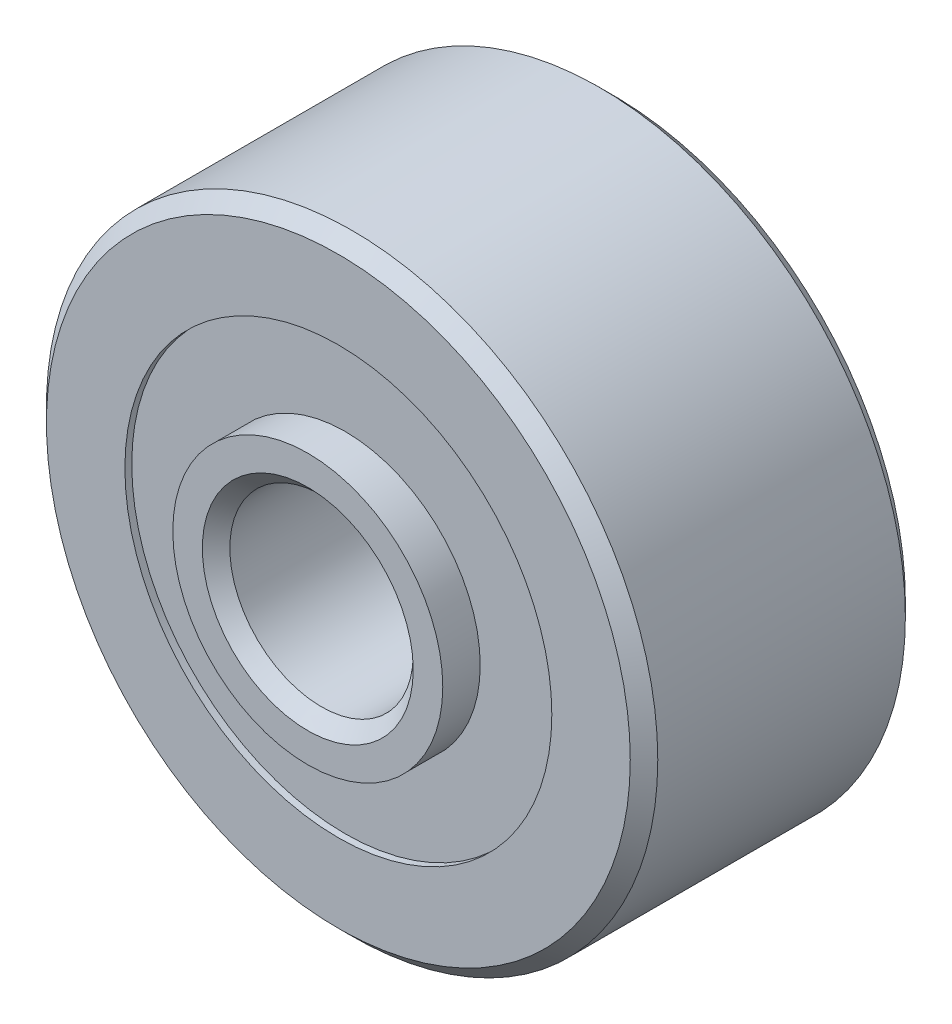
ISO-10303-21;
HEADER;
FILE_DESCRIPTION(('STEP AP214'),'2;1');
FILE_NAME('part.step','',(''),(''),'','','');
FILE_SCHEMA(('AUTOMOTIVE_DESIGN { 1 0 10303 214 1 1 1 1 }'));
ENDSEC;
DATA;
#1=APPLICATION_CONTEXT('core data for automotive mechanical design processes');
#2=APPLICATION_PROTOCOL_DEFINITION('international standard','automotive_design',2000,#1);
#3=PRODUCT_CONTEXT('',#1,'mechanical');
#4=PRODUCT('Part','Part','',(#3));
#5=PRODUCT_RELATED_PRODUCT_CATEGORY('part','',(#4));
#6=PRODUCT_DEFINITION_FORMATION('','',#4);
#7=PRODUCT_DEFINITION_CONTEXT('part definition',#1,'design');
#8=PRODUCT_DEFINITION('design','',#6,#7);
#9=PRODUCT_DEFINITION_SHAPE('','',#8);
#10=(LENGTH_UNIT() NAMED_UNIT(*) SI_UNIT(.MILLI.,.METRE.));
#11=(NAMED_UNIT(*) PLANE_ANGLE_UNIT() SI_UNIT($,.RADIAN.));
#12=(NAMED_UNIT(*) SI_UNIT($,.STERADIAN.) SOLID_ANGLE_UNIT());
#13=UNCERTAINTY_MEASURE_WITH_UNIT(LENGTH_MEASURE(1.E-05),#10,'distance_accuracy_value','');
#14=(GEOMETRIC_REPRESENTATION_CONTEXT(3) GLOBAL_UNCERTAINTY_ASSIGNED_CONTEXT((#13)) GLOBAL_UNIT_ASSIGNED_CONTEXT((#10,
#11,#12)) REPRESENTATION_CONTEXT('',''));
#15=CARTESIAN_POINT('',(0.,0.,0.));
#16=DIRECTION('',(0.,0.,1.));
#17=DIRECTION('',(1.,0.,0.));
#18=AXIS2_PLACEMENT_3D('',#15,#16,#17);
#19=CARTESIAN_POINT('',(0.,2.7715831043956,-1.696640625));
#20=DIRECTION('',(0.,0.,1.));
#21=DIRECTION('',(1.,0.,0.));
#22=AXIS2_PLACEMENT_3D('',#19,#20,#21);
#23=PLANE('',#22);
#24=CARTESIAN_POINT('',(0.,0.,-1.696640625));
#25=DIRECTION('',(0.,0.,1.));
#26=DIRECTION('',(1.,0.,0.));
#27=AXIS2_PLACEMENT_3D('',#24,#25,#26);
#28=CIRCLE('',#27,2.7715831043956);
#29=CARTESIAN_POINT('',(2.7715831043956,0.,-1.696640625));
#30=VERTEX_POINT('',#29);
#31=EDGE_CURVE('E57',#30,#30,#28,.T.);
#32=ORIENTED_EDGE('',*,*,#31,.F.);
#33=EDGE_LOOP('',(#32));
#34=FACE_BOUND('',#33,.T.);
#35=CARTESIAN_POINT('',(0.,0.,-1.696640625));
#36=DIRECTION('',(0.,0.,1.));
#37=DIRECTION('',(1.,0.,0.));
#38=AXIS2_PLACEMENT_3D('',#35,#36,#37);
#39=CIRCLE('',#38,1.7526);
#40=CARTESIAN_POINT('',(1.7526,0.,-1.696640625));
#41=VERTEX_POINT('',#40);
#42=EDGE_CURVE('E11',#41,#41,#39,.T.);
#43=ORIENTED_EDGE('',*,*,#42,.T.);
#44=EDGE_LOOP('',(#43));
#45=FACE_BOUND('',#44,.T.);
#46=ADVANCED_FACE('F43',(#34,#45),#23,.F.);
#47=CARTESIAN_POINT('',(0.,0.,1.7859375));
#48=DIRECTION('',(0.,0.,1.));
#49=DIRECTION('',(1.,0.,0.));
#50=AXIS2_PLACEMENT_3D('',#47,#48,#49);
#51=CYLINDRICAL_SURFACE('',#50,1.7526);
#52=ORIENTED_EDGE('',*,*,#42,.F.);
#53=EDGE_LOOP('',(#52));
#54=FACE_BOUND('',#53,.T.);
#55=CARTESIAN_POINT('',(0.,0.,-0.816616792312253));
#56=DIRECTION('',(0.,0.,1.));
#57=DIRECTION('',(1.,0.,0.));
#58=AXIS2_PLACEMENT_3D('',#55,#56,#57);
#59=CIRCLE('',#58,1.7526);
#60=CARTESIAN_POINT('',(1.7526,0.,-0.816616792312253));
#61=VERTEX_POINT('',#60);
#62=EDGE_CURVE('E49',#61,#61,#59,.T.);
#63=ORIENTED_EDGE('',*,*,#62,.T.);
#64=EDGE_LOOP('',(#63));
#65=FACE_BOUND('',#64,.T.);
#66=ADVANCED_FACE('F66',(#54,#65),#51,.F.);
#67=CARTESIAN_POINT('',(0.,2.7715831043956,-0.816616792312253));
#68=DIRECTION('',(0.,0.,-1.));
#69=DIRECTION('',(-1.,0.,0.));
#70=AXIS2_PLACEMENT_3D('',#67,#68,#69);
#71=PLANE('',#70);
#72=ORIENTED_EDGE('',*,*,#62,.F.);
#73=EDGE_LOOP('',(#72));
#74=FACE_BOUND('',#73,.T.);
#75=CARTESIAN_POINT('',(0.,0.,-0.816616792312253));
#76=DIRECTION('',(0.,0.,1.));
#77=DIRECTION('',(1.,0.,0.));
#78=AXIS2_PLACEMENT_3D('',#75,#76,#77);
#79=CIRCLE('',#78,2.7715831043956);
#80=CARTESIAN_POINT('',(2.7715831043956,0.,-0.816616792312253));
#81=VERTEX_POINT('',#80);
#82=EDGE_CURVE('E53',#81,#81,#79,.T.);
#83=ORIENTED_EDGE('',*,*,#82,.T.);
#84=EDGE_LOOP('',(#83));
#85=FACE_BOUND('',#84,.T.);
#86=ADVANCED_FACE('F70',(#74,#85),#71,.F.);
#87=CARTESIAN_POINT('',(0.,0.,1.7859375));
#88=DIRECTION('',(0.,0.,1.));
#89=DIRECTION('',(1.,0.,0.));
#90=AXIS2_PLACEMENT_3D('',#87,#88,#89);
#91=CYLINDRICAL_SURFACE('',#90,2.7715831043956);
#92=ORIENTED_EDGE('',*,*,#82,.F.);
#93=EDGE_LOOP('',(#92));
#94=FACE_BOUND('',#93,.T.);
#95=ORIENTED_EDGE('',*,*,#31,.T.);
#96=EDGE_LOOP('',(#95));
#97=FACE_BOUND('',#96,.T.);
#98=ADVANCED_FACE('F63',(#94,#97),#91,.T.);
#99=CLOSED_SHELL('',(#46,#66,#86,#98));
#100=MANIFOLD_SOLID_BREP('B2',#99);
#101=CARTESIAN_POINT('',(0.,2.7715831043956,1.696640625));
#102=DIRECTION('',(0.,0.,-1.));
#103=DIRECTION('',(-1.,0.,0.));
#104=AXIS2_PLACEMENT_3D('',#101,#102,#103);
#105=PLANE('',#104);
#106=CARTESIAN_POINT('',(0.,0.,1.696640625));
#107=DIRECTION('',(0.,0.,1.));
#108=DIRECTION('',(1.,0.,0.));
#109=AXIS2_PLACEMENT_3D('',#106,#107,#108);
#110=CIRCLE('',#109,1.7526);
#111=CARTESIAN_POINT('',(1.7526,0.,1.696640625));
#112=VERTEX_POINT('',#111);
#113=EDGE_CURVE('E42',#112,#112,#110,.T.);
#114=ORIENTED_EDGE('',*,*,#113,.F.);
#115=EDGE_LOOP('',(#114));
#116=FACE_BOUND('',#115,.T.);
#117=CARTESIAN_POINT('',(0.,0.,1.696640625));
#118=DIRECTION('',(0.,0.,1.));
#119=DIRECTION('',(1.,0.,0.));
#120=AXIS2_PLACEMENT_3D('',#117,#118,#119);
#121=CIRCLE('',#120,2.7715831043956);
#122=CARTESIAN_POINT('',(2.7715831043956,0.,1.696640625));
#123=VERTEX_POINT('',#122);
#124=EDGE_CURVE('E124',#123,#123,#121,.T.);
#125=ORIENTED_EDGE('',*,*,#124,.T.);
#126=EDGE_LOOP('',(#125));
#127=FACE_BOUND('',#126,.T.);
#128=ADVANCED_FACE('F110',(#116,#127),#105,.F.);
#129=CARTESIAN_POINT('',(0.,0.,1.7859375));
#130=DIRECTION('',(0.,0.,1.));
#131=DIRECTION('',(1.,0.,0.));
#132=AXIS2_PLACEMENT_3D('',#129,#130,#131);
#133=CYLINDRICAL_SURFACE('',#132,1.7526);
#134=CARTESIAN_POINT('',(0.,0.,0.816616792312253));
#135=DIRECTION('',(0.,0.,1.));
#136=DIRECTION('',(1.,0.,0.));
#137=AXIS2_PLACEMENT_3D('',#134,#135,#136);
#138=CIRCLE('',#137,1.7526);
#139=CARTESIAN_POINT('',(1.7526,0.,0.816616792312253));
#140=VERTEX_POINT('',#139);
#141=EDGE_CURVE('E116',#140,#140,#138,.T.);
#142=ORIENTED_EDGE('',*,*,#141,.F.);
#143=EDGE_LOOP('',(#142));
#144=FACE_BOUND('',#143,.T.);
#145=ORIENTED_EDGE('',*,*,#113,.T.);
#146=EDGE_LOOP('',(#145));
#147=FACE_BOUND('',#146,.T.);
#148=ADVANCED_FACE('F139',(#144,#147),#133,.F.);
#149=CARTESIAN_POINT('',(0.,2.7715831043956,0.816616792312254));
#150=DIRECTION('',(0.,0.,1.));
#151=DIRECTION('',(1.,0.,0.));
#152=AXIS2_PLACEMENT_3D('',#149,#150,#151);
#153=PLANE('',#152);
#154=CARTESIAN_POINT('',(0.,0.,0.816616792312254));
#155=DIRECTION('',(0.,0.,1.));
#156=DIRECTION('',(1.,0.,0.));
#157=AXIS2_PLACEMENT_3D('',#154,#155,#156);
#158=CIRCLE('',#157,2.7715831043956);
#159=CARTESIAN_POINT('',(2.7715831043956,0.,0.816616792312254));
#160=VERTEX_POINT('',#159);
#161=EDGE_CURVE('E120',#160,#160,#158,.T.);
#162=ORIENTED_EDGE('',*,*,#161,.F.);
#163=EDGE_LOOP('',(#162));
#164=FACE_BOUND('',#163,.T.);
#165=ORIENTED_EDGE('',*,*,#141,.T.);
#166=EDGE_LOOP('',(#165));
#167=FACE_BOUND('',#166,.T.);
#168=ADVANCED_FACE('F134',(#164,#167),#153,.F.);
#169=CARTESIAN_POINT('',(0.,0.,1.7859375));
#170=DIRECTION('',(0.,0.,1.));
#171=DIRECTION('',(1.,0.,0.));
#172=AXIS2_PLACEMENT_3D('',#169,#170,#171);
#173=CYLINDRICAL_SURFACE('',#172,2.7715831043956);
#174=ORIENTED_EDGE('',*,*,#124,.F.);
#175=EDGE_LOOP('',(#174));
#176=FACE_BOUND('',#175,.T.);
#177=ORIENTED_EDGE('',*,*,#161,.T.);
#178=EDGE_LOOP('',(#177));
#179=FACE_BOUND('',#178,.T.);
#180=ADVANCED_FACE('F131',(#176,#179),#173,.T.);
#181=CLOSED_SHELL('',(#128,#148,#168,#180));
#182=MANIFOLD_SOLID_BREP('B6',#181);
#183=CARTESIAN_POINT('',(-1.82411452459215,1.82411452459219,0.));
#184=DIRECTION('',(0.,0.,1.));
#185=DIRECTION('',(-0.707106781186539,0.707106781186556,0.));
#186=AXIS2_PLACEMENT_3D('',#183,#184,#185);
#187=SPHERICAL_SURFACE('',#186,0.816616792312253);
#188=CARTESIAN_POINT('',(-1.82411452459215,1.82411452459219,0.816616792312254));
#189=VERTEX_POINT('',#188);
#190=VERTEX_LOOP('',#189);
#191=FACE_BOUND('',#190,.T.);
#192=ADVANCED_FACE('F177',(#191),#187,.T.);
#193=CLOSED_SHELL('',(#192));
#194=MANIFOLD_SOLID_BREP('B37',#193);
#195=CARTESIAN_POINT('',(-2.5796875,0.,0.));
#196=DIRECTION('',(0.,0.,1.));
#197=DIRECTION('',(-1.,0.,0.));
#198=AXIS2_PLACEMENT_3D('',#195,#196,#197);
#199=SPHERICAL_SURFACE('',#198,0.816616792312253);
#200=CARTESIAN_POINT('',(-2.5796875,0.,0.816616792312254));
#201=VERTEX_POINT('',#200);
#202=VERTEX_LOOP('',#201);
#203=FACE_BOUND('',#202,.T.);
#204=ADVANCED_FACE('F197',(#203),#199,.T.);
#205=CLOSED_SHELL('',(#204));
#206=MANIFOLD_SOLID_BREP('B106',#205);
#207=CARTESIAN_POINT('',(-1.82411452459219,-1.82411452459216,0.));
#208=DIRECTION('',(0.,0.,1.));
#209=DIRECTION('',(-0.707106781186554,-0.707106781186541,0.));
#210=AXIS2_PLACEMENT_3D('',#207,#208,#209);
#211=SPHERICAL_SURFACE('',#210,0.816616792312253);
#212=CARTESIAN_POINT('',(-1.82411452459219,-1.82411452459216,0.816616792312254));
#213=VERTEX_POINT('',#212);
#214=VERTEX_LOOP('',#213);
#215=FACE_BOUND('',#214,.T.);
#216=ADVANCED_FACE('F217',(#215),#211,.T.);
#217=CLOSED_SHELL('',(#216));
#218=MANIFOLD_SOLID_BREP('B173',#217);
#219=CARTESIAN_POINT('',(0.,-2.5796875,0.));
#220=DIRECTION('',(0.,0.,1.));
#221=DIRECTION('',(0.,-1.,0.));
#222=AXIS2_PLACEMENT_3D('',#219,#220,#221);
#223=SPHERICAL_SURFACE('',#222,0.816616792312253);
#224=CARTESIAN_POINT('',(0.,-2.5796875,0.816616792312254));
#225=VERTEX_POINT('',#224);
#226=VERTEX_LOOP('',#225);
#227=FACE_BOUND('',#226,.T.);
#228=ADVANCED_FACE('F237',(#227),#223,.T.);
#229=CLOSED_SHELL('',(#228));
#230=MANIFOLD_SOLID_BREP('B193',#229);
#231=CARTESIAN_POINT('',(1.82411452459216,-1.82411452459218,0.));
#232=DIRECTION('',(0.,0.,1.));
#233=DIRECTION('',(0.707106781186544,-0.707106781186551,0.));
#234=AXIS2_PLACEMENT_3D('',#231,#232,#233);
#235=SPHERICAL_SURFACE('',#234,0.816616792312253);
#236=CARTESIAN_POINT('',(1.82411452459216,-1.82411452459218,0.816616792312254));
#237=VERTEX_POINT('',#236);
#238=VERTEX_LOOP('',#237);
#239=FACE_BOUND('',#238,.T.);
#240=ADVANCED_FACE('F257',(#239),#235,.T.);
#241=CLOSED_SHELL('',(#240));
#242=MANIFOLD_SOLID_BREP('B213',#241);
#243=CARTESIAN_POINT('',(2.5796875,0.,0.));
#244=DIRECTION('',(0.,0.,1.));
#245=DIRECTION('',(1.,0.,0.));
#246=AXIS2_PLACEMENT_3D('',#243,#244,#245);
#247=SPHERICAL_SURFACE('',#246,0.816616792312253);
#248=CARTESIAN_POINT('',(2.5796875,0.,0.816616792312254));
#249=VERTEX_POINT('',#248);
#250=VERTEX_LOOP('',#249);
#251=FACE_BOUND('',#250,.T.);
#252=ADVANCED_FACE('F277',(#251),#247,.T.);
#253=CLOSED_SHELL('',(#252));
#254=MANIFOLD_SOLID_BREP('B233',#253);
#255=CARTESIAN_POINT('',(1.82411452459218,1.82411452459217,0.));
#256=DIRECTION('',(0.,0.,1.));
#257=DIRECTION('',(0.707106781186549,0.707106781186546,0.));
#258=AXIS2_PLACEMENT_3D('',#255,#256,#257);
#259=SPHERICAL_SURFACE('',#258,0.816616792312253);
#260=CARTESIAN_POINT('',(1.82411452459218,1.82411452459217,0.816616792312254));
#261=VERTEX_POINT('',#260);
#262=VERTEX_LOOP('',#261);
#263=FACE_BOUND('',#262,.T.);
#264=ADVANCED_FACE('F297',(#263),#259,.T.);
#265=CLOSED_SHELL('',(#264));
#266=MANIFOLD_SOLID_BREP('B253',#265);
#267=CARTESIAN_POINT('',(0.,2.5796875,0.));
#268=DIRECTION('',(0.,0.,1.));
#269=DIRECTION('',(0.,1.,0.));
#270=AXIS2_PLACEMENT_3D('',#267,#268,#269);
#271=SPHERICAL_SURFACE('',#270,0.816616792312253);
#272=CARTESIAN_POINT('',(0.,2.5796875,0.816616792312254));
#273=VERTEX_POINT('',#272);
#274=VERTEX_LOOP('',#273);
#275=FACE_BOUND('',#274,.T.);
#276=ADVANCED_FACE('F319',(#275),#271,.T.);
#277=CLOSED_SHELL('',(#276));
#278=MANIFOLD_SOLID_BREP('B273',#277);
#279=CARTESIAN_POINT('',(0.,0.,2.1828125));
#280=DIRECTION('',(0.,0.,1.));
#281=DIRECTION('',(1.,0.,0.));
#282=AXIS2_PLACEMENT_3D('',#279,#280,#281);
#283=CONICAL_SURFACE('',#282,1.36921875,0.785398163397446);
#284=CARTESIAN_POINT('',(0.,0.,2.00421875));
#285=DIRECTION('',(0.,0.,1.));
#286=DIRECTION('',(1.,0.,0.));
#287=AXIS2_PLACEMENT_3D('',#284,#285,#286);
#288=CIRCLE('',#287,1.190625);
#289=CARTESIAN_POINT('',(1.190625,0.,2.00421875));
#290=VERTEX_POINT('',#289);
#291=EDGE_CURVE('E318',#290,#290,#288,.T.);
#292=ORIENTED_EDGE('',*,*,#291,.F.);
#293=EDGE_LOOP('',(#292));
#294=FACE_BOUND('',#293,.T.);
#295=CARTESIAN_POINT('',(0.,0.,2.1828125));
#296=DIRECTION('',(0.,0.,1.));
#297=DIRECTION('',(1.,0.,0.));
#298=AXIS2_PLACEMENT_3D('',#295,#296,#297);
#299=CIRCLE('',#298,1.36921875);
#300=CARTESIAN_POINT('',(1.36921875,0.,2.1828125));
#301=VERTEX_POINT('',#300);
#302=EDGE_CURVE('E360',#301,#301,#299,.T.);
#303=ORIENTED_EDGE('',*,*,#302,.T.);
#304=EDGE_LOOP('',(#303));
#305=FACE_BOUND('',#304,.T.);
#306=ADVANCED_FACE('F338',(#294,#305),#283,.F.);
#307=CARTESIAN_POINT('',(0.,0.,1.7859375));
#308=DIRECTION('',(0.,0.,1.));
#309=DIRECTION('',(1.,0.,0.));
#310=AXIS2_PLACEMENT_3D('',#307,#308,#309);
#311=CYLINDRICAL_SURFACE('',#310,1.190625);
#312=CARTESIAN_POINT('',(0.,0.,-2.00421875));
#313=DIRECTION('',(0.,0.,1.));
#314=DIRECTION('',(1.,0.,0.));
#315=AXIS2_PLACEMENT_3D('',#312,#313,#314);
#316=CIRCLE('',#315,1.190625);
#317=CARTESIAN_POINT('',(1.190625,0.,-2.00421875));
#318=VERTEX_POINT('',#317);
#319=EDGE_CURVE('E344',#318,#318,#316,.T.);
#320=ORIENTED_EDGE('',*,*,#319,.F.);
#321=EDGE_LOOP('',(#320));
#322=FACE_BOUND('',#321,.T.);
#323=ORIENTED_EDGE('',*,*,#291,.T.);
#324=EDGE_LOOP('',(#323));
#325=FACE_BOUND('',#324,.T.);
#326=ADVANCED_FACE('F385',(#322,#325),#311,.F.);
#327=CARTESIAN_POINT('',(0.,0.,-2.00421875));
#328=DIRECTION('',(0.,0.,-1.));
#329=DIRECTION('',(-1.,0.,0.));
#330=AXIS2_PLACEMENT_3D('',#327,#328,#329);
#331=CONICAL_SURFACE('',#330,1.190625,0.785398163397447);
#332=CARTESIAN_POINT('',(0.,0.,-2.1828125));
#333=DIRECTION('',(0.,0.,1.));
#334=DIRECTION('',(1.,0.,0.));
#335=AXIS2_PLACEMENT_3D('',#332,#333,#334);
#336=CIRCLE('',#335,1.36921875);
#337=CARTESIAN_POINT('',(1.36921875,0.,-2.1828125));
#338=VERTEX_POINT('',#337);
#339=EDGE_CURVE('E348',#338,#338,#336,.T.);
#340=ORIENTED_EDGE('',*,*,#339,.F.);
#341=EDGE_LOOP('',(#340));
#342=FACE_BOUND('',#341,.T.);
#343=ORIENTED_EDGE('',*,*,#319,.T.);
#344=EDGE_LOOP('',(#343));
#345=FACE_BOUND('',#344,.T.);
#346=ADVANCED_FACE('F380',(#342,#345),#331,.F.);
#347=CARTESIAN_POINT('',(0.,1.7526,-2.1828125));
#348=DIRECTION('',(0.,0.,1.));
#349=DIRECTION('',(1.,0.,0.));
#350=AXIS2_PLACEMENT_3D('',#347,#348,#349);
#351=PLANE('',#350);
#352=CARTESIAN_POINT('',(0.,0.,-2.1828125));
#353=DIRECTION('',(0.,0.,1.));
#354=DIRECTION('',(1.,0.,0.));
#355=AXIS2_PLACEMENT_3D('',#352,#353,#354);
#356=CIRCLE('',#355,1.7526);
#357=CARTESIAN_POINT('',(1.7526,0.,-2.1828125));
#358=VERTEX_POINT('',#357);
#359=EDGE_CURVE('E352',#358,#358,#356,.T.);
#360=ORIENTED_EDGE('',*,*,#359,.F.);
#361=EDGE_LOOP('',(#360));
#362=FACE_BOUND('',#361,.T.);
#363=ORIENTED_EDGE('',*,*,#339,.T.);
#364=EDGE_LOOP('',(#363));
#365=FACE_BOUND('',#364,.T.);
#366=ADVANCED_FACE('F374',(#362,#365),#351,.F.);
#367=CARTESIAN_POINT('',(0.,0.,1.7859375));
#368=DIRECTION('',(0.,0.,1.));
#369=DIRECTION('',(1.,0.,0.));
#370=AXIS2_PLACEMENT_3D('',#367,#368,#369);
#371=CYLINDRICAL_SURFACE('',#370,1.7526);
#372=CARTESIAN_POINT('',(0.,0.,2.1828125));
#373=DIRECTION('',(0.,0.,1.));
#374=DIRECTION('',(1.,0.,0.));
#375=AXIS2_PLACEMENT_3D('',#372,#373,#374);
#376=CIRCLE('',#375,1.7526);
#377=CARTESIAN_POINT('',(1.7526,0.,2.1828125));
#378=VERTEX_POINT('',#377);
#379=EDGE_CURVE('E357',#378,#378,#376,.T.);
#380=ORIENTED_EDGE('',*,*,#379,.F.);
#381=EDGE_LOOP('',(#380));
#382=FACE_BOUND('',#381,.T.);
#383=ORIENTED_EDGE('',*,*,#359,.T.);
#384=EDGE_LOOP('',(#383));
#385=FACE_BOUND('',#384,.T.);
#386=ADVANCED_FACE('F368',(#382,#385),#371,.T.);
#387=CARTESIAN_POINT('',(0.,1.36921875,2.1828125));
#388=DIRECTION('',(0.,0.,-1.));
#389=DIRECTION('',(-1.,0.,0.));
#390=AXIS2_PLACEMENT_3D('',#387,#388,#389);
#391=PLANE('',#390);
#392=ORIENTED_EDGE('',*,*,#302,.F.);
#393=EDGE_LOOP('',(#392));
#394=FACE_BOUND('',#393,.T.);
#395=ORIENTED_EDGE('',*,*,#379,.T.);
#396=EDGE_LOOP('',(#395));
#397=FACE_BOUND('',#396,.T.);
#398=ADVANCED_FACE('F365',(#394,#397),#391,.F.);
#399=CLOSED_SHELL('',(#306,#326,#346,#366,#386,#398));
#400=MANIFOLD_SOLID_BREP('B293',#399);
#401=CARTESIAN_POINT('',(0.,0.,1.60734375));
#402=DIRECTION('',(0.,0.,-1.));
#403=DIRECTION('',(-1.,0.,0.));
#404=AXIS2_PLACEMENT_3D('',#401,#402,#403);
#405=CONICAL_SURFACE('',#404,3.96875,0.785398163397447);
#406=CARTESIAN_POINT('',(0.,0.,1.7859375));
#407=DIRECTION('',(0.,0.,1.));
#408=DIRECTION('',(1.,0.,0.));
#409=AXIS2_PLACEMENT_3D('',#406,#407,#408);
#410=CIRCLE('',#409,3.79015625);
#411=CARTESIAN_POINT('',(3.79015625,0.,1.7859375));
#412=VERTEX_POINT('',#411);
#413=EDGE_CURVE('E457',#412,#412,#410,.T.);
#414=ORIENTED_EDGE('',*,*,#413,.F.);
#415=EDGE_LOOP('',(#414));
#416=FACE_BOUND('',#415,.T.);
#417=CARTESIAN_POINT('',(0.,0.,1.60734375));
#418=DIRECTION('',(0.,0.,1.));
#419=DIRECTION('',(1.,0.,0.));
#420=AXIS2_PLACEMENT_3D('',#417,#418,#419);
#421=CIRCLE('',#420,3.96875);
#422=CARTESIAN_POINT('',(3.96875,0.,1.60734375));
#423=VERTEX_POINT('',#422);
#424=EDGE_CURVE('E337',#423,#423,#421,.T.);
#425=ORIENTED_EDGE('',*,*,#424,.T.);
#426=EDGE_LOOP('',(#425));
#427=FACE_BOUND('',#426,.T.);
#428=ADVANCED_FACE('F429',(#416,#427),#405,.T.);
#429=CARTESIAN_POINT('',(0.,0.,1.7859375));
#430=DIRECTION('',(0.,0.,1.));
#431=DIRECTION('',(1.,0.,0.));
#432=AXIS2_PLACEMENT_3D('',#429,#430,#431);
#433=CYLINDRICAL_SURFACE('',#432,3.96875);
#434=ORIENTED_EDGE('',*,*,#424,.F.);
#435=EDGE_LOOP('',(#434));
#436=FACE_BOUND('',#435,.T.);
#437=CARTESIAN_POINT('',(0.,0.,-1.60734375));
#438=DIRECTION('',(0.,0.,1.));
#439=DIRECTION('',(1.,0.,0.));
#440=AXIS2_PLACEMENT_3D('',#437,#438,#439);
#441=CIRCLE('',#440,3.96875);
#442=CARTESIAN_POINT('',(3.96875,0.,-1.60734375));
#443=VERTEX_POINT('',#442);
#444=EDGE_CURVE('E435',#443,#443,#441,.T.);
#445=ORIENTED_EDGE('',*,*,#444,.T.);
#446=EDGE_LOOP('',(#445));
#447=FACE_BOUND('',#446,.T.);
#448=ADVANCED_FACE('F464',(#436,#447),#433,.T.);
#449=CARTESIAN_POINT('',(0.,0.,-1.7859375));
#450=DIRECTION('',(0.,0.,1.));
#451=DIRECTION('',(1.,0.,0.));
#452=AXIS2_PLACEMENT_3D('',#449,#450,#451);
#453=CONICAL_SURFACE('',#452,3.79015625,0.785398163397446);
#454=ORIENTED_EDGE('',*,*,#444,.F.);
#455=EDGE_LOOP('',(#454));
#456=FACE_BOUND('',#455,.T.);
#457=CARTESIAN_POINT('',(0.,0.,-1.7859375));
#458=DIRECTION('',(0.,0.,1.));
#459=DIRECTION('',(1.,0.,0.));
#460=AXIS2_PLACEMENT_3D('',#457,#458,#459);
#461=CIRCLE('',#460,3.79015625);
#462=CARTESIAN_POINT('',(3.79015625,0.,-1.7859375));
#463=VERTEX_POINT('',#462);
#464=EDGE_CURVE('E439',#463,#463,#461,.T.);
#465=ORIENTED_EDGE('',*,*,#464,.T.);
#466=EDGE_LOOP('',(#465));
#467=FACE_BOUND('',#466,.T.);
#468=ADVANCED_FACE('F468',(#456,#467),#453,.T.);
#469=CARTESIAN_POINT('',(0.,3.79015625,-1.7859375));
#470=DIRECTION('',(0.,0.,1.));
#471=DIRECTION('',(1.,0.,0.));
#472=AXIS2_PLACEMENT_3D('',#469,#470,#471);
#473=PLANE('',#472);
#474=ORIENTED_EDGE('',*,*,#464,.F.);
#475=EDGE_LOOP('',(#474));
#476=FACE_BOUND('',#475,.T.);
#477=CARTESIAN_POINT('',(0.,0.,-1.7859375));
#478=DIRECTION('',(0.,0.,1.));
#479=DIRECTION('',(1.,0.,0.));
#480=AXIS2_PLACEMENT_3D('',#477,#478,#479);
#481=CIRCLE('',#480,2.7715831043956);
#482=CARTESIAN_POINT('',(2.7715831043956,0.,-1.7859375));
#483=VERTEX_POINT('',#482);
#484=EDGE_CURVE('E443',#483,#483,#481,.T.);
#485=ORIENTED_EDGE('',*,*,#484,.T.);
#486=EDGE_LOOP('',(#485));
#487=FACE_BOUND('',#486,.T.);
#488=ADVANCED_FACE('F473',(#476,#487),#473,.F.);
#489=CARTESIAN_POINT('',(0.,0.,1.7859375));
#490=DIRECTION('',(0.,0.,1.));
#491=DIRECTION('',(1.,0.,0.));
#492=AXIS2_PLACEMENT_3D('',#489,#490,#491);
#493=CYLINDRICAL_SURFACE('',#492,2.7715831043956);
#494=ORIENTED_EDGE('',*,*,#484,.F.);
#495=EDGE_LOOP('',(#494));
#496=FACE_BOUND('',#495,.T.);
#497=CARTESIAN_POINT('',(0.,0.,-0.79375));
#498=DIRECTION('',(0.,0.,1.));
#499=DIRECTION('',(1.,0.,0.));
#500=AXIS2_PLACEMENT_3D('',#497,#498,#499);
#501=CIRCLE('',#500,2.7715831043956);
#502=CARTESIAN_POINT('',(2.7715831043956,0.,-0.79375));
#503=VERTEX_POINT('',#502);
#504=EDGE_CURVE('E448',#503,#503,#501,.T.);
#505=ORIENTED_EDGE('',*,*,#504,.T.);
#506=EDGE_LOOP('',(#505));
#507=FACE_BOUND('',#506,.T.);
#508=ADVANCED_FACE('F479',(#496,#507),#493,.F.);
#509=CARTESIAN_POINT('',(0.,0.,0.));
#510=DIRECTION('',(0.,0.,1.));
#511=DIRECTION('',(1.,0.,0.));
#512=AXIS2_PLACEMENT_3D('',#509,#510,#511);
#513=TOROIDAL_SURFACE('',#512,2.5796875,0.816616792312253);
#514=ORIENTED_EDGE('',*,*,#504,.F.);
#515=EDGE_LOOP('',(#514));
#516=FACE_BOUND('',#515,.T.);
#517=CARTESIAN_POINT('',(0.,0.,0.79375));
#518=DIRECTION('',(0.,0.,1.));
#519=DIRECTION('',(1.,0.,0.));
#520=AXIS2_PLACEMENT_3D('',#517,#518,#519);
#521=CIRCLE('',#520,2.7715831043956);
#522=CARTESIAN_POINT('',(2.7715831043956,0.,0.79375));
#523=VERTEX_POINT('',#522);
#524=EDGE_CURVE('E451',#523,#523,#521,.T.);
#525=ORIENTED_EDGE('',*,*,#524,.T.);
#526=EDGE_LOOP('',(#525));
#527=FACE_BOUND('',#526,.T.);
#528=ADVANCED_FACE('F483',(#516,#527),#513,.F.);
#529=CARTESIAN_POINT('',(0.,0.,1.7859375));
#530=DIRECTION('',(0.,0.,1.));
#531=DIRECTION('',(1.,0.,0.));
#532=AXIS2_PLACEMENT_3D('',#529,#530,#531);
#533=CYLINDRICAL_SURFACE('',#532,2.7715831043956);
#534=ORIENTED_EDGE('',*,*,#524,.F.);
#535=EDGE_LOOP('',(#534));
#536=FACE_BOUND('',#535,.T.);
#537=CARTESIAN_POINT('',(0.,0.,1.7859375));
#538=DIRECTION('',(0.,0.,1.));
#539=DIRECTION('',(1.,0.,0.));
#540=AXIS2_PLACEMENT_3D('',#537,#538,#539);
#541=CIRCLE('',#540,2.7715831043956);
#542=CARTESIAN_POINT('',(2.7715831043956,0.,1.7859375));
#543=VERTEX_POINT('',#542);
#544=EDGE_CURVE('E454',#543,#543,#541,.T.);
#545=ORIENTED_EDGE('',*,*,#544,.T.);
#546=EDGE_LOOP('',(#545));
#547=FACE_BOUND('',#546,.T.);
#548=ADVANCED_FACE('F487',(#536,#547),#533,.F.);
#549=CARTESIAN_POINT('',(0.,3.79015625,1.7859375));
#550=DIRECTION('',(0.,0.,-1.));
#551=DIRECTION('',(-1.,0.,0.));
#552=AXIS2_PLACEMENT_3D('',#549,#550,#551);
#553=PLANE('',#552);
#554=ORIENTED_EDGE('',*,*,#544,.F.);
#555=EDGE_LOOP('',(#554));
#556=FACE_BOUND('',#555,.T.);
#557=ORIENTED_EDGE('',*,*,#413,.T.);
#558=EDGE_LOOP('',(#557));
#559=FACE_BOUND('',#558,.T.);
#560=ADVANCED_FACE('F461',(#556,#559),#553,.F.);
#561=CLOSED_SHELL('',(#428,#448,#468,#488,#508,#528,#548,#560));
#562=MANIFOLD_SOLID_BREP('B313',#561);
#563=ADVANCED_BREP_SHAPE_REPRESENTATION('',(#18,#100,#182,#194,#206,#218,#230,#242,#254,#266,
#278,#400,#562),#14);
#564=SHAPE_DEFINITION_REPRESENTATION(#9,#563);
ENDSEC;
END-ISO-10303-21;
